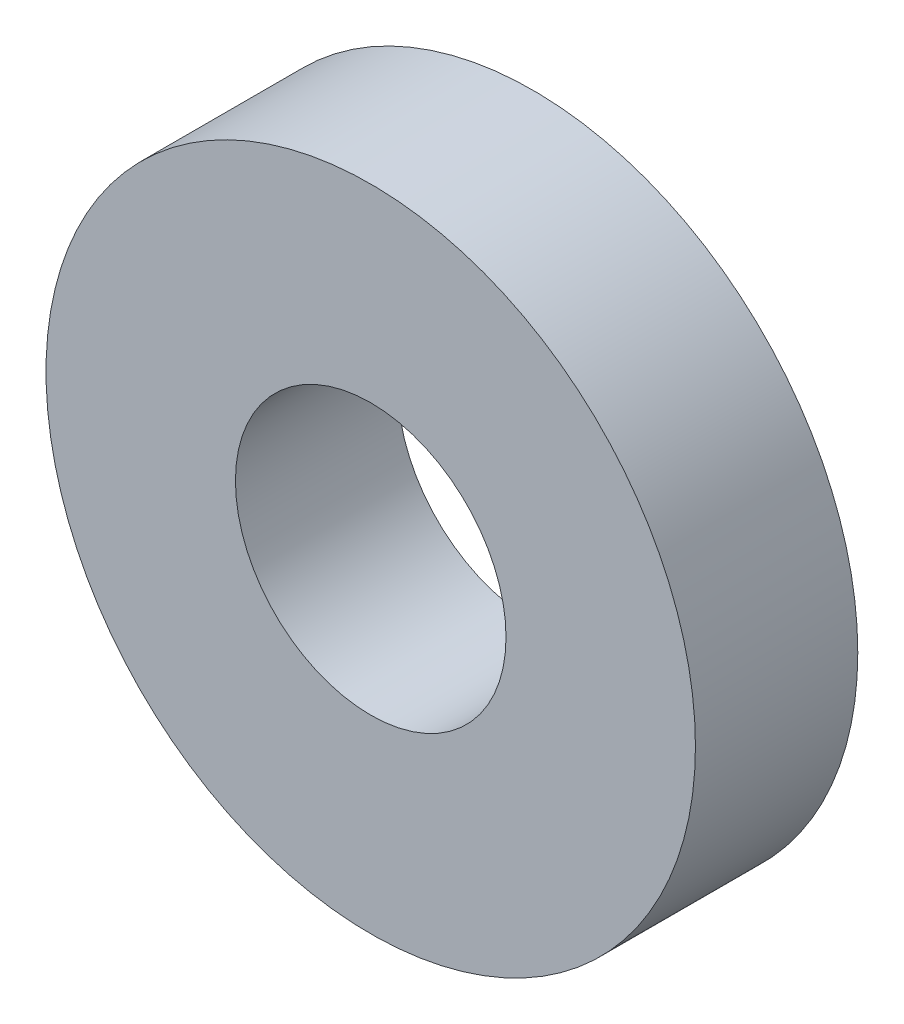
ISO-10303-21;
HEADER;
FILE_DESCRIPTION(('STEP AP214'),'2;1');
FILE_NAME('part.step','',(''),(''),'','','');
FILE_SCHEMA(('AUTOMOTIVE_DESIGN { 1 0 10303 214 1 1 1 1 }'));
ENDSEC;
DATA;
#1=APPLICATION_CONTEXT('core data for automotive mechanical design processes');
#2=APPLICATION_PROTOCOL_DEFINITION('international standard','automotive_design',2000,#1);
#3=PRODUCT_CONTEXT('',#1,'mechanical');
#4=PRODUCT('Part','Part','',(#3));
#5=PRODUCT_RELATED_PRODUCT_CATEGORY('part','',(#4));
#6=PRODUCT_DEFINITION_FORMATION('','',#4);
#7=PRODUCT_DEFINITION_CONTEXT('part definition',#1,'design');
#8=PRODUCT_DEFINITION('design','',#6,#7);
#9=PRODUCT_DEFINITION_SHAPE('','',#8);
#10=(LENGTH_UNIT() NAMED_UNIT(*) SI_UNIT(.MILLI.,.METRE.));
#11=(NAMED_UNIT(*) PLANE_ANGLE_UNIT() SI_UNIT($,.RADIAN.));
#12=(NAMED_UNIT(*) SI_UNIT($,.STERADIAN.) SOLID_ANGLE_UNIT());
#13=UNCERTAINTY_MEASURE_WITH_UNIT(LENGTH_MEASURE(1.E-05),#10,'distance_accuracy_value','');
#14=(GEOMETRIC_REPRESENTATION_CONTEXT(3) GLOBAL_UNCERTAINTY_ASSIGNED_CONTEXT((#13)) GLOBAL_UNIT_ASSIGNED_CONTEXT((#10,
#11,#12)) REPRESENTATION_CONTEXT('',''));
#15=CARTESIAN_POINT('',(0.,0.,0.));
#16=DIRECTION('',(0.,0.,1.));
#17=DIRECTION('',(1.,0.,0.));
#18=AXIS2_PLACEMENT_3D('',#15,#16,#17);
#19=CARTESIAN_POINT('',(0.,0.,6.));
#20=DIRECTION('',(0.,0.,1.));
#21=DIRECTION('',(1.,0.,0.));
#22=AXIS2_PLACEMENT_3D('',#19,#20,#21);
#23=PLANE('',#22);
#24=CARTESIAN_POINT('',(0.,0.,6.));
#25=DIRECTION('',(0.,0.,1.));
#26=DIRECTION('',(1.,0.,0.));
#27=AXIS2_PLACEMENT_3D('',#24,#25,#26);
#28=CIRCLE('',#27,12.);
#29=CARTESIAN_POINT('',(12.,0.,6.));
#30=VERTEX_POINT('',#29);
#31=EDGE_CURVE('E10',#30,#30,#28,.T.);
#32=ORIENTED_EDGE('',*,*,#31,.T.);
#33=EDGE_LOOP('',(#32));
#34=FACE_BOUND('',#33,.T.);
#35=CARTESIAN_POINT('',(0.,0.,6.));
#36=DIRECTION('',(0.,0.,1.));
#37=DIRECTION('',(1.,0.,0.));
#38=AXIS2_PLACEMENT_3D('',#35,#36,#37);
#39=CIRCLE('',#38,5.);
#40=CARTESIAN_POINT('',(5.,0.,6.));
#41=VERTEX_POINT('',#40);
#42=EDGE_CURVE('E50',#41,#41,#39,.T.);
#43=ORIENTED_EDGE('',*,*,#42,.F.);
#44=EDGE_LOOP('',(#43));
#45=FACE_BOUND('',#44,.T.);
#46=ADVANCED_FACE('F37',(#34,#45),#23,.T.);
#47=CARTESIAN_POINT('',(0.,0.,0.));
#48=DIRECTION('',(0.,0.,1.));
#49=DIRECTION('',(1.,0.,0.));
#50=AXIS2_PLACEMENT_3D('',#47,#48,#49);
#51=PLANE('',#50);
#52=CARTESIAN_POINT('',(0.,0.,0.));
#53=DIRECTION('',(0.,0.,1.));
#54=DIRECTION('',(1.,0.,0.));
#55=AXIS2_PLACEMENT_3D('',#52,#53,#54);
#56=CIRCLE('',#55,12.);
#57=CARTESIAN_POINT('',(12.,0.,0.));
#58=VERTEX_POINT('',#57);
#59=EDGE_CURVE('E41',#58,#58,#56,.T.);
#60=ORIENTED_EDGE('',*,*,#59,.F.);
#61=EDGE_LOOP('',(#60));
#62=FACE_BOUND('',#61,.T.);
#63=CARTESIAN_POINT('',(0.,0.,0.));
#64=DIRECTION('',(0.,0.,1.));
#65=DIRECTION('',(1.,0.,0.));
#66=AXIS2_PLACEMENT_3D('',#63,#64,#65);
#67=CIRCLE('',#66,5.);
#68=CARTESIAN_POINT('',(5.,0.,0.));
#69=VERTEX_POINT('',#68);
#70=EDGE_CURVE('E52',#69,#69,#67,.T.);
#71=ORIENTED_EDGE('',*,*,#70,.T.);
#72=EDGE_LOOP('',(#71));
#73=FACE_BOUND('',#72,.T.);
#74=ADVANCED_FACE('F64',(#62,#73),#51,.F.);
#75=CARTESIAN_POINT('',(0.,0.,6.));
#76=DIRECTION('',(0.,0.,-1.));
#77=DIRECTION('',(-1.,0.,0.));
#78=AXIS2_PLACEMENT_3D('',#75,#76,#77);
#79=CYLINDRICAL_SURFACE('',#78,12.);
#80=ORIENTED_EDGE('',*,*,#31,.F.);
#81=EDGE_LOOP('',(#80));
#82=FACE_BOUND('',#81,.T.);
#83=ORIENTED_EDGE('',*,*,#59,.T.);
#84=EDGE_LOOP('',(#83));
#85=FACE_BOUND('',#84,.T.);
#86=ADVANCED_FACE('F39',(#82,#85),#79,.T.);
#87=CARTESIAN_POINT('',(0.,0.,6.));
#88=DIRECTION('',(0.,0.,-1.));
#89=DIRECTION('',(-1.,0.,0.));
#90=AXIS2_PLACEMENT_3D('',#87,#88,#89);
#91=CYLINDRICAL_SURFACE('',#90,5.);
#92=ORIENTED_EDGE('',*,*,#42,.T.);
#93=EDGE_LOOP('',(#92));
#94=FACE_BOUND('',#93,.T.);
#95=ORIENTED_EDGE('',*,*,#70,.F.);
#96=EDGE_LOOP('',(#95));
#97=FACE_BOUND('',#96,.T.);
#98=ADVANCED_FACE('F60',(#94,#97),#91,.F.);
#99=CLOSED_SHELL('',(#46,#74,#86,#98));
#100=MANIFOLD_SOLID_BREP('B2',#99);
#101=ADVANCED_BREP_SHAPE_REPRESENTATION('',(#18,#100),#14);
#102=SHAPE_DEFINITION_REPRESENTATION(#9,#101);
ENDSEC;
END-ISO-10303-21;
